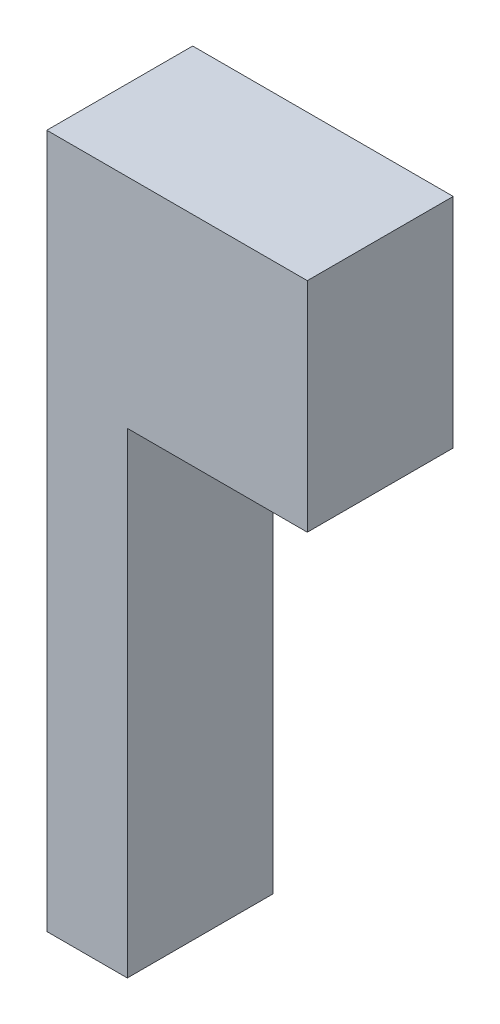
ISO-10303-21;
HEADER;
FILE_DESCRIPTION(('STEP AP214'),'2;1');
FILE_NAME('part.step','',(''),(''),'','','');
FILE_SCHEMA(('AUTOMOTIVE_DESIGN { 1 0 10303 214 1 1 1 1 }'));
ENDSEC;
DATA;
#1=APPLICATION_CONTEXT('core data for automotive mechanical design processes');
#2=APPLICATION_PROTOCOL_DEFINITION('international standard','automotive_design',2000,#1);
#3=PRODUCT_CONTEXT('',#1,'mechanical');
#4=PRODUCT('Part','Part','',(#3));
#5=PRODUCT_RELATED_PRODUCT_CATEGORY('part','',(#4));
#6=PRODUCT_DEFINITION_FORMATION('','',#4);
#7=PRODUCT_DEFINITION_CONTEXT('part definition',#1,'design');
#8=PRODUCT_DEFINITION('design','',#6,#7);
#9=PRODUCT_DEFINITION_SHAPE('','',#8);
#10=(LENGTH_UNIT() NAMED_UNIT(*) SI_UNIT(.MILLI.,.METRE.));
#11=(NAMED_UNIT(*) PLANE_ANGLE_UNIT() SI_UNIT($,.RADIAN.));
#12=(NAMED_UNIT(*) SI_UNIT($,.STERADIAN.) SOLID_ANGLE_UNIT());
#13=UNCERTAINTY_MEASURE_WITH_UNIT(LENGTH_MEASURE(1.E-05),#10,'distance_accuracy_value','');
#14=(GEOMETRIC_REPRESENTATION_CONTEXT(3) GLOBAL_UNCERTAINTY_ASSIGNED_CONTEXT((#13)) GLOBAL_UNIT_ASSIGNED_CONTEXT((#10,
#11,#12)) REPRESENTATION_CONTEXT('',''));
#15=CARTESIAN_POINT('',(0.,0.,0.));
#16=DIRECTION('',(0.,0.,1.));
#17=DIRECTION('',(1.,0.,0.));
#18=AXIS2_PLACEMENT_3D('',#15,#16,#17);
#19=CARTESIAN_POINT('',(0.,0.,6.16));
#20=DIRECTION('',(0.,1.,0.));
#21=DIRECTION('',(0.,0.,1.));
#22=AXIS2_PLACEMENT_3D('',#19,#20,#21);
#23=PLANE('',#22);
#24=DIRECTION('',(1.,0.,0.));
#25=VECTOR('',#24,1.);
#26=CARTESIAN_POINT('',(0.,0.,0.));
#27=LINE('',#26,#25);
#28=CARTESIAN_POINT('',(0.,0.,0.));
#29=VERTEX_POINT('',#28);
#30=CARTESIAN_POINT('',(3.4,0.,0.));
#31=VERTEX_POINT('',#30);
#32=EDGE_CURVE('E122',#29,#31,#27,.T.);
#33=ORIENTED_EDGE('',*,*,#32,.T.);
#34=DIRECTION('',(0.,0.,-1.));
#35=VECTOR('',#34,1.);
#36=CARTESIAN_POINT('',(3.4,0.,6.16));
#37=LINE('',#36,#35);
#38=CARTESIAN_POINT('',(3.4,0.,6.16));
#39=VERTEX_POINT('',#38);
#40=EDGE_CURVE('E11',#39,#31,#37,.T.);
#41=ORIENTED_EDGE('',*,*,#40,.F.);
#42=DIRECTION('',(1.,0.,0.));
#43=VECTOR('',#42,1.);
#44=CARTESIAN_POINT('',(0.,0.,6.16));
#45=LINE('',#44,#43);
#46=CARTESIAN_POINT('',(0.,0.,6.16));
#47=VERTEX_POINT('',#46);
#48=EDGE_CURVE('E153',#47,#39,#45,.T.);
#49=ORIENTED_EDGE('',*,*,#48,.F.);
#50=DIRECTION('',(0.,0.,-1.));
#51=VECTOR('',#50,1.);
#52=CARTESIAN_POINT('',(0.,0.,6.16));
#53=LINE('',#52,#51);
#54=EDGE_CURVE('E67',#47,#29,#53,.T.);
#55=ORIENTED_EDGE('',*,*,#54,.T.);
#56=EDGE_LOOP('',(#33,#41,#49,#55));
#57=FACE_BOUND('',#56,.T.);
#58=ADVANCED_FACE('F47',(#57),#23,.F.);
#59=CARTESIAN_POINT('',(3.4,0.,6.16));
#60=DIRECTION('',(-1.,0.,0.));
#61=DIRECTION('',(0.,0.,1.));
#62=AXIS2_PLACEMENT_3D('',#59,#60,#61);
#63=PLANE('',#62);
#64=DIRECTION('',(0.,1.,0.));
#65=VECTOR('',#64,1.);
#66=CARTESIAN_POINT('',(3.4,0.,0.));
#67=LINE('',#66,#65);
#68=CARTESIAN_POINT('',(3.4,20.1,0.));
#69=VERTEX_POINT('',#68);
#70=EDGE_CURVE('E154',#31,#69,#67,.T.);
#71=ORIENTED_EDGE('',*,*,#70,.T.);
#72=DIRECTION('',(0.,0.,-1.));
#73=VECTOR('',#72,1.);
#74=CARTESIAN_POINT('',(3.4,20.1,6.16));
#75=LINE('',#74,#73);
#76=CARTESIAN_POINT('',(3.4,20.1,6.16));
#77=VERTEX_POINT('',#76);
#78=EDGE_CURVE('E58',#77,#69,#75,.T.);
#79=ORIENTED_EDGE('',*,*,#78,.F.);
#80=DIRECTION('',(0.,1.,0.));
#81=VECTOR('',#80,1.);
#82=CARTESIAN_POINT('',(3.4,0.,6.16));
#83=LINE('',#82,#81);
#84=EDGE_CURVE('E162',#39,#77,#83,.T.);
#85=ORIENTED_EDGE('',*,*,#84,.F.);
#86=ORIENTED_EDGE('',*,*,#40,.T.);
#87=EDGE_LOOP('',(#71,#79,#85,#86));
#88=FACE_BOUND('',#87,.T.);
#89=ADVANCED_FACE('F174',(#88),#63,.F.);
#90=CARTESIAN_POINT('',(0.,0.,6.16));
#91=DIRECTION('',(-1.,0.,0.));
#92=DIRECTION('',(0.,0.,1.));
#93=AXIS2_PLACEMENT_3D('',#90,#91,#92);
#94=PLANE('',#93);
#95=DIRECTION('',(0.,1.,0.));
#96=VECTOR('',#95,1.);
#97=CARTESIAN_POINT('',(0.,0.,0.));
#98=LINE('',#97,#96);
#99=CARTESIAN_POINT('',(0.,29.3,0.));
#100=VERTEX_POINT('',#99);
#101=EDGE_CURVE('E150',#29,#100,#98,.T.);
#102=ORIENTED_EDGE('',*,*,#101,.F.);
#103=ORIENTED_EDGE('',*,*,#54,.F.);
#104=DIRECTION('',(0.,1.,0.));
#105=VECTOR('',#104,1.);
#106=CARTESIAN_POINT('',(0.,0.,6.16));
#107=LINE('',#106,#105);
#108=CARTESIAN_POINT('',(0.,29.3,6.16));
#109=VERTEX_POINT('',#108);
#110=EDGE_CURVE('E149',#47,#109,#107,.T.);
#111=ORIENTED_EDGE('',*,*,#110,.T.);
#112=DIRECTION('',(0.,0.,-1.));
#113=VECTOR('',#112,1.);
#114=CARTESIAN_POINT('',(0.,29.3,6.16));
#115=LINE('',#114,#113);
#116=EDGE_CURVE('E51',#109,#100,#115,.T.);
#117=ORIENTED_EDGE('',*,*,#116,.T.);
#118=EDGE_LOOP('',(#102,#103,#111,#117));
#119=FACE_BOUND('',#118,.T.);
#120=ADVANCED_FACE('F175',(#119),#94,.T.);
#121=CARTESIAN_POINT('',(0.,0.,6.16));
#122=DIRECTION('',(0.,0.,1.));
#123=DIRECTION('',(1.,0.,0.));
#124=AXIS2_PLACEMENT_3D('',#121,#122,#123);
#125=PLANE('',#124);
#126=ORIENTED_EDGE('',*,*,#48,.T.);
#127=ORIENTED_EDGE('',*,*,#84,.T.);
#128=DIRECTION('',(1.,0.,0.));
#129=VECTOR('',#128,1.);
#130=CARTESIAN_POINT('',(0.,20.1,6.16));
#131=LINE('',#130,#129);
#132=CARTESIAN_POINT('',(11.,20.1,6.16));
#133=VERTEX_POINT('',#132);
#134=EDGE_CURVE('E135',#77,#133,#131,.T.);
#135=ORIENTED_EDGE('',*,*,#134,.T.);
#136=DIRECTION('',(0.,1.,0.));
#137=VECTOR('',#136,1.);
#138=CARTESIAN_POINT('',(11.,20.1,6.16));
#139=LINE('',#138,#137);
#140=CARTESIAN_POINT('',(11.,29.3,6.16));
#141=VERTEX_POINT('',#140);
#142=EDGE_CURVE('E120',#133,#141,#139,.T.);
#143=ORIENTED_EDGE('',*,*,#142,.T.);
#144=DIRECTION('',(1.,0.,0.));
#145=VECTOR('',#144,1.);
#146=CARTESIAN_POINT('',(0.,29.3,6.16));
#147=LINE('',#146,#145);
#148=EDGE_CURVE('E114',#109,#141,#147,.T.);
#149=ORIENTED_EDGE('',*,*,#148,.F.);
#150=ORIENTED_EDGE('',*,*,#110,.F.);
#151=EDGE_LOOP('',(#126,#127,#135,#143,#149,#150));
#152=FACE_BOUND('',#151,.T.);
#153=ADVANCED_FACE('F169',(#152),#125,.T.);
#154=CARTESIAN_POINT('',(0.,0.,0.));
#155=DIRECTION('',(0.,0.,1.));
#156=DIRECTION('',(1.,0.,0.));
#157=AXIS2_PLACEMENT_3D('',#154,#155,#156);
#158=PLANE('',#157);
#159=ORIENTED_EDGE('',*,*,#32,.F.);
#160=ORIENTED_EDGE('',*,*,#101,.T.);
#161=DIRECTION('',(1.,0.,0.));
#162=VECTOR('',#161,1.);
#163=CARTESIAN_POINT('',(0.,29.3,0.));
#164=LINE('',#163,#162);
#165=CARTESIAN_POINT('',(11.,29.3,0.));
#166=VERTEX_POINT('',#165);
#167=EDGE_CURVE('E126',#100,#166,#164,.T.);
#168=ORIENTED_EDGE('',*,*,#167,.T.);
#169=DIRECTION('',(0.,1.,0.));
#170=VECTOR('',#169,1.);
#171=CARTESIAN_POINT('',(11.,20.1,0.));
#172=LINE('',#171,#170);
#173=CARTESIAN_POINT('',(11.,20.1,0.));
#174=VERTEX_POINT('',#173);
#175=EDGE_CURVE('E115',#174,#166,#172,.T.);
#176=ORIENTED_EDGE('',*,*,#175,.F.);
#177=DIRECTION('',(1.,0.,0.));
#178=VECTOR('',#177,1.);
#179=CARTESIAN_POINT('',(0.,20.1,0.));
#180=LINE('',#179,#178);
#181=EDGE_CURVE('E104',#69,#174,#180,.T.);
#182=ORIENTED_EDGE('',*,*,#181,.F.);
#183=ORIENTED_EDGE('',*,*,#70,.F.);
#184=EDGE_LOOP('',(#159,#160,#168,#176,#182,#183));
#185=FACE_BOUND('',#184,.T.);
#186=ADVANCED_FACE('F125',(#185),#158,.F.);
#187=CARTESIAN_POINT('',(0.,29.3,6.16));
#188=DIRECTION('',(0.,1.,0.));
#189=DIRECTION('',(0.,0.,1.));
#190=AXIS2_PLACEMENT_3D('',#187,#188,#189);
#191=PLANE('',#190);
#192=ORIENTED_EDGE('',*,*,#167,.F.);
#193=ORIENTED_EDGE('',*,*,#116,.F.);
#194=ORIENTED_EDGE('',*,*,#148,.T.);
#195=DIRECTION('',(0.,0.,-1.));
#196=VECTOR('',#195,1.);
#197=CARTESIAN_POINT('',(11.,29.3,6.16));
#198=LINE('',#197,#196);
#199=EDGE_CURVE('E98',#141,#166,#198,.T.);
#200=ORIENTED_EDGE('',*,*,#199,.T.);
#201=EDGE_LOOP('',(#192,#193,#194,#200));
#202=FACE_BOUND('',#201,.T.);
#203=ADVANCED_FACE('F49',(#202),#191,.T.);
#204=CARTESIAN_POINT('',(11.,20.1,6.16));
#205=DIRECTION('',(-1.,0.,0.));
#206=DIRECTION('',(0.,0.,1.));
#207=AXIS2_PLACEMENT_3D('',#204,#205,#206);
#208=PLANE('',#207);
#209=ORIENTED_EDGE('',*,*,#175,.T.);
#210=ORIENTED_EDGE('',*,*,#199,.F.);
#211=ORIENTED_EDGE('',*,*,#142,.F.);
#212=DIRECTION('',(0.,0.,-1.));
#213=VECTOR('',#212,1.);
#214=CARTESIAN_POINT('',(11.,20.1,6.16));
#215=LINE('',#214,#213);
#216=EDGE_CURVE('E108',#133,#174,#215,.T.);
#217=ORIENTED_EDGE('',*,*,#216,.T.);
#218=EDGE_LOOP('',(#209,#210,#211,#217));
#219=FACE_BOUND('',#218,.T.);
#220=ADVANCED_FACE('F118',(#219),#208,.F.);
#221=CARTESIAN_POINT('',(0.,20.1,6.16));
#222=DIRECTION('',(0.,1.,0.));
#223=DIRECTION('',(0.,0.,1.));
#224=AXIS2_PLACEMENT_3D('',#221,#222,#223);
#225=PLANE('',#224);
#226=ORIENTED_EDGE('',*,*,#134,.F.);
#227=ORIENTED_EDGE('',*,*,#78,.T.);
#228=ORIENTED_EDGE('',*,*,#181,.T.);
#229=ORIENTED_EDGE('',*,*,#216,.F.);
#230=EDGE_LOOP('',(#226,#227,#228,#229));
#231=FACE_BOUND('',#230,.T.);
#232=ADVANCED_FACE('F107',(#231),#225,.F.);
#233=CLOSED_SHELL('',(#58,#89,#120,#153,#186,#203,#220,#232));
#234=MANIFOLD_SOLID_BREP('B2',#233);
#235=ADVANCED_BREP_SHAPE_REPRESENTATION('',(#18,#234),#14);
#236=SHAPE_DEFINITION_REPRESENTATION(#9,#235);
ENDSEC;
END-ISO-10303-21;
